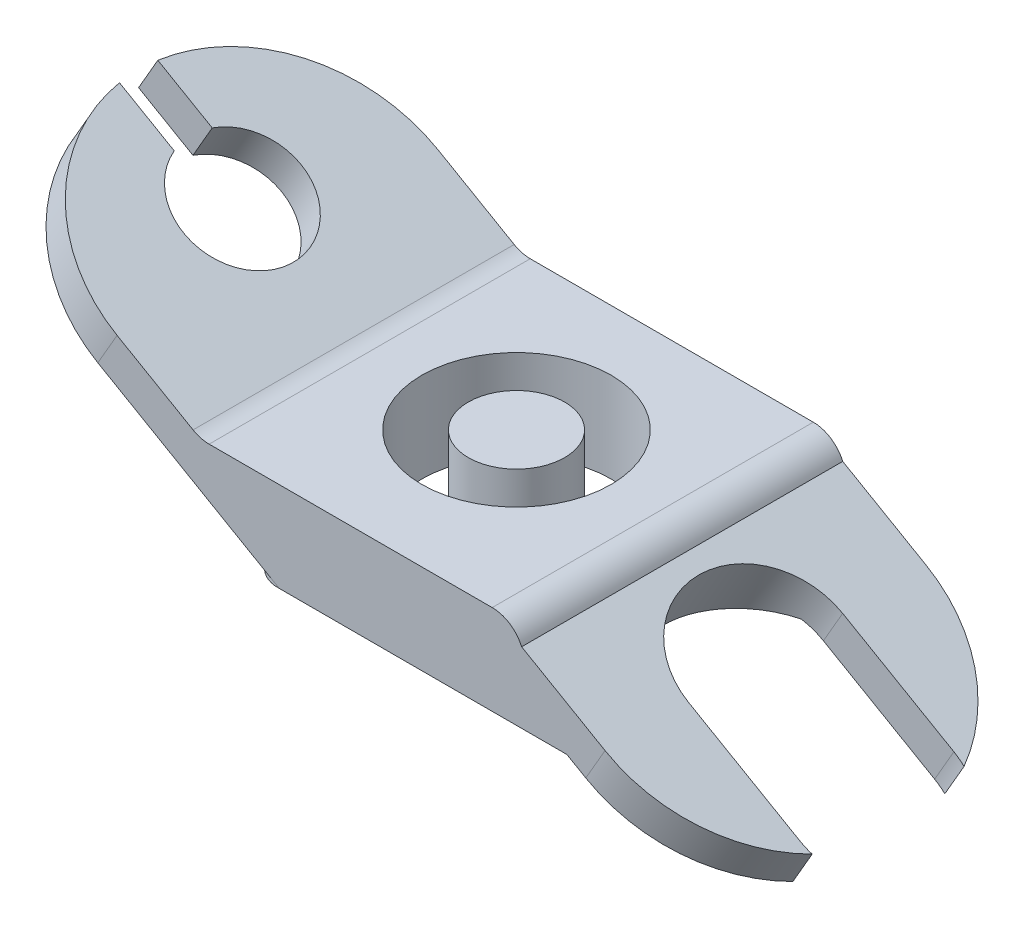
ISO-10303-21;
HEADER;
FILE_DESCRIPTION(('STEP AP214'),'2;1');
FILE_NAME('part.step','',(''),(''),'','','');
FILE_SCHEMA(('AUTOMOTIVE_DESIGN { 1 0 10303 214 1 1 1 1 }'));
ENDSEC;
DATA;
#1=APPLICATION_CONTEXT('core data for automotive mechanical design processes');
#2=APPLICATION_PROTOCOL_DEFINITION('international standard','automotive_design',2000,#1);
#3=PRODUCT_CONTEXT('',#1,'mechanical');
#4=PRODUCT('Part','Part','',(#3));
#5=PRODUCT_RELATED_PRODUCT_CATEGORY('part','',(#4));
#6=PRODUCT_DEFINITION_FORMATION('','',#4);
#7=PRODUCT_DEFINITION_CONTEXT('part definition',#1,'design');
#8=PRODUCT_DEFINITION('design','',#6,#7);
#9=PRODUCT_DEFINITION_SHAPE('','',#8);
#10=(LENGTH_UNIT() NAMED_UNIT(*) SI_UNIT(.MILLI.,.METRE.));
#11=(NAMED_UNIT(*) PLANE_ANGLE_UNIT() SI_UNIT($,.RADIAN.));
#12=(NAMED_UNIT(*) SI_UNIT($,.STERADIAN.) SOLID_ANGLE_UNIT());
#13=UNCERTAINTY_MEASURE_WITH_UNIT(LENGTH_MEASURE(1.E-05),#10,'distance_accuracy_value','');
#14=(GEOMETRIC_REPRESENTATION_CONTEXT(3) GLOBAL_UNCERTAINTY_ASSIGNED_CONTEXT((#13)) GLOBAL_UNIT_ASSIGNED_CONTEXT((#10,
#11,#12)) REPRESENTATION_CONTEXT('',''));
#15=CARTESIAN_POINT('',(0.,0.,0.));
#16=DIRECTION('',(0.,0.,1.));
#17=DIRECTION('',(1.,0.,0.));
#18=AXIS2_PLACEMENT_3D('',#15,#16,#17);
#19=CARTESIAN_POINT('',(74.5884572681199,-14.1961524227064,50.));
#20=DIRECTION('',(0.499999999999994,0.866025403784442,0.));
#21=DIRECTION('',(-0.866025403784442,0.499999999999994,0.));
#22=AXIS2_PLACEMENT_3D('',#19,#20,#21);
#23=PLANE('',#22);
#24=DIRECTION('',(-0.866025403784442,0.499999999999994,0.));
#25=VECTOR('',#24,1.);
#26=CARTESIAN_POINT('',(74.5884572681199,-14.1961524227064,13.));
#27=LINE('',#26,#25);
#28=CARTESIAN_POINT('',(70.2583302491977,-11.6961524227064,13.));
#29=VERTEX_POINT('',#28);
#30=CARTESIAN_POINT('',(52.9378221735089,-1.69615242270657,13.));
#31=VERTEX_POINT('',#30);
#32=EDGE_CURVE('E476',#29,#31,#27,.T.);
#33=ORIENTED_EDGE('',*,*,#32,.T.);
#34=CARTESIAN_POINT('',(52.9378221735089,-1.69615242270657,25.));
#35=DIRECTION('',(0.499999999999994,0.866025403784442,0.));
#36=DIRECTION('',(-0.866025403784442,0.499999999999994,0.));
#37=AXIS2_PLACEMENT_3D('',#34,#35,#36);
#38=CIRCLE('',#37,12.);
#39=CARTESIAN_POINT('',(50.,0.,13.4894714354298));
#40=VERTEX_POINT('',#39);
#41=EDGE_CURVE('E326',#31,#40,#38,.T.);
#42=ORIENTED_EDGE('',*,*,#41,.T.);
#43=DIRECTION('',(0.,0.,-1.));
#44=VECTOR('',#43,1.);
#45=CARTESIAN_POINT('',(50.,0.,50.));
#46=LINE('',#45,#44);
#47=CARTESIAN_POINT('',(50.,0.,0.));
#48=VERTEX_POINT('',#47);
#49=EDGE_CURVE('E228',#40,#48,#46,.T.);
#50=ORIENTED_EDGE('',*,*,#49,.T.);
#51=DIRECTION('',(0.866025403784442,-0.499999999999994,0.));
#52=VECTOR('',#51,1.);
#53=CARTESIAN_POINT('',(74.5884572681199,-14.1961524227064,0.));
#54=LINE('',#53,#52);
#55=CARTESIAN_POINT('',(52.9378221735089,-1.69615242270657,0.));
#56=VERTEX_POINT('',#55);
#57=EDGE_CURVE('E225',#48,#56,#54,.T.);
#58=ORIENTED_EDGE('',*,*,#57,.T.);
#59=CARTESIAN_POINT('',(52.9378221735089,-1.69615242270657,25.));
#60=DIRECTION('',(0.499999999999994,0.866025403784442,0.));
#61=DIRECTION('',(-0.866025403784442,0.499999999999994,0.));
#62=AXIS2_PLACEMENT_3D('',#59,#60,#61);
#63=CIRCLE('',#62,25.);
#64=CARTESIAN_POINT('',(72.0120316918612,-12.7086524227064,13.1720933804836));
#65=VERTEX_POINT('',#64);
#66=EDGE_CURVE('E220',#56,#65,#63,.F.);
#67=ORIENTED_EDGE('',*,*,#66,.T.);
#68=CARTESIAN_POINT('',(70.2583302491977,-11.6961524227064,25.));
#69=DIRECTION('',(0.499999999999994,0.866025403784442,0.));
#70=DIRECTION('',(-0.866025403784442,0.499999999999994,0.));
#71=AXIS2_PLACEMENT_3D('',#68,#69,#70);
#72=CIRCLE('',#71,12.);
#73=EDGE_CURVE('E62',#65,#29,#72,.T.);
#74=ORIENTED_EDGE('',*,*,#73,.T.);
#75=EDGE_LOOP('',(#33,#42,#50,#58,#67,#74));
#76=FACE_BOUND('',#75,.T.);
#77=ADVANCED_FACE('F47',(#76),#23,.F.);
#78=CARTESIAN_POINT('',(-41.6935750346355,33.9999999999998,50.));
#79=DIRECTION('',(-0.499999999999994,-0.866025403784442,0.));
#80=DIRECTION('',(0.866025403784442,-0.499999999999994,0.));
#81=AXIS2_PLACEMENT_3D('',#78,#79,#80);
#82=PLANE('',#81);
#83=DIRECTION('',(-0.866025403784442,0.499999999999994,0.));
#84=VECTOR('',#83,1.);
#85=CARTESIAN_POINT('',(4.29903810567661,7.44615242270668,28.1458706267444));
#86=LINE('',#85,#84);
#87=CARTESIAN_POINT('',(-32.9978385349474,28.9795141911029,28.1458706267443));
#88=VERTEX_POINT('',#87);
#89=CARTESIAN_POINT('',(-41.5214786123793,33.9006400842836,28.1458706267443));
#90=VERTEX_POINT('',#89);
#91=EDGE_CURVE('E323',#88,#90,#86,.T.);
#92=ORIENTED_EDGE('',*,*,#91,.T.);
#93=CARTESIAN_POINT('',(-20.0429399400244,21.4999999999999,25.));
#94=DIRECTION('',(-0.499999999999994,-0.866025403784442,0.));
#95=DIRECTION('',(0.866025403784442,-0.499999999999994,0.));
#96=AXIS2_PLACEMENT_3D('',#93,#94,#95);
#97=CIRCLE('',#96,25.);
#98=CARTESIAN_POINT('',(-20.0429399400244,21.4999999999999,50.));
#99=VERTEX_POINT('',#98);
#100=EDGE_CURVE('E192',#90,#99,#97,.F.);
#101=ORIENTED_EDGE('',*,*,#100,.T.);
#102=DIRECTION('',(-0.866025403784442,0.499999999999994,0.));
#103=VECTOR('',#102,1.);
#104=CARTESIAN_POINT('',(-41.6935750346355,33.9999999999998,50.));
#105=LINE('',#104,#103);
#106=CARTESIAN_POINT('',(-8.2128129211022,14.6698729810778,50.));
#107=VERTEX_POINT('',#106);
#108=EDGE_CURVE('E219',#107,#99,#105,.T.);
#109=ORIENTED_EDGE('',*,*,#108,.F.);
#110=DIRECTION('',(0.,0.,-1.));
#111=VECTOR('',#110,1.);
#112=CARTESIAN_POINT('',(-8.21281292110219,14.6698729810778,0.));
#113=LINE('',#112,#111);
#114=CARTESIAN_POINT('',(-8.2128129211022,14.6698729810778,0.));
#115=VERTEX_POINT('',#114);
#116=EDGE_CURVE('E269',#107,#115,#113,.T.);
#117=ORIENTED_EDGE('',*,*,#116,.T.);
#118=DIRECTION('',(-0.866025403784442,0.499999999999994,0.));
#119=VECTOR('',#118,1.);
#120=CARTESIAN_POINT('',(-41.6935750346355,33.9999999999998,0.));
#121=LINE('',#120,#119);
#122=CARTESIAN_POINT('',(-20.0429399400244,21.4999999999999,0.));
#123=VERTEX_POINT('',#122);
#124=EDGE_CURVE('E265',#115,#123,#121,.T.);
#125=ORIENTED_EDGE('',*,*,#124,.T.);
#126=CARTESIAN_POINT('',(-20.0429399400244,21.4999999999999,25.));
#127=DIRECTION('',(-0.499999999999994,-0.866025403784442,0.));
#128=DIRECTION('',(0.866025403784442,-0.499999999999994,0.));
#129=AXIS2_PLACEMENT_3D('',#126,#127,#128);
#130=CIRCLE('',#129,25.);
#131=CARTESIAN_POINT('',(-41.5520184684167,33.9182722783878,22.1458706267443));
#132=VERTEX_POINT('',#131);
#133=EDGE_CURVE('E268',#123,#132,#130,.F.);
#134=ORIENTED_EDGE('',*,*,#133,.T.);
#135=DIRECTION('',(-0.866025403784442,0.499999999999994,0.));
#136=VECTOR('',#135,1.);
#137=CARTESIAN_POINT('',(4.29903810567661,7.44615242270668,22.1458706267443));
#138=LINE('',#137,#136);
#139=CARTESIAN_POINT('',(-33.0852649662696,29.029989864761,22.1458706267443));
#140=VERTEX_POINT('',#139);
#141=EDGE_CURVE('E316',#140,#132,#138,.T.);
#142=ORIENTED_EDGE('',*,*,#141,.F.);
#143=CARTESIAN_POINT('',(-25.533320996791,24.6698729810777,25.));
#144=DIRECTION('',(0.499999999999994,0.866025403784442,0.));
#145=DIRECTION('',(-0.866025403784442,0.499999999999994,0.));
#146=AXIS2_PLACEMENT_3D('',#143,#144,#145);
#147=CIRCLE('',#146,9.1754308583741);
#148=EDGE_CURVE('E184',#88,#140,#147,.T.);
#149=ORIENTED_EDGE('',*,*,#148,.F.);
#150=EDGE_LOOP('',(#92,#101,#109,#117,#125,#134,#142,#149));
#151=FACE_BOUND('',#150,.T.);
#152=ADVANCED_FACE('F365',(#151),#82,.F.);
#153=CARTESIAN_POINT('',(0.,3.,50.));
#154=DIRECTION('',(0.499999999999994,0.866025403784442,0.));
#155=DIRECTION('',(-0.866025403784442,0.499999999999994,0.));
#156=AXIS2_PLACEMENT_3D('',#153,#154,#155);
#157=PLANE('',#156);
#158=DIRECTION('',(-0.866025403784442,0.499999999999994,0.));
#159=VECTOR('',#158,1.);
#160=CARTESIAN_POINT('',(0.,3.,28.1458706267444));
#161=LINE('',#160,#159);
#162=CARTESIAN_POINT('',(-35.9978385349473,23.7833617683962,28.1458706267443));
#163=VERTEX_POINT('',#162);
#164=CARTESIAN_POINT('',(-44.5214786123793,28.704487661577,28.1458706267443));
#165=VERTEX_POINT('',#164);
#166=EDGE_CURVE('E174',#163,#165,#161,.T.);
#167=ORIENTED_EDGE('',*,*,#166,.F.);
#168=CARTESIAN_POINT('',(-28.533320996791,19.473720558371,25.));
#169=DIRECTION('',(0.499999999999994,0.866025403784442,0.));
#170=DIRECTION('',(-0.866025403784442,0.499999999999994,0.));
#171=AXIS2_PLACEMENT_3D('',#168,#169,#170);
#172=CIRCLE('',#171,9.1754308583741);
#173=CARTESIAN_POINT('',(-36.0852649662695,23.8338374420544,22.1458706267443));
#174=VERTEX_POINT('',#173);
#175=EDGE_CURVE('E311',#163,#174,#172,.T.);
#176=ORIENTED_EDGE('',*,*,#175,.T.);
#177=DIRECTION('',(-0.866025403784442,0.499999999999994,0.));
#178=VECTOR('',#177,1.);
#179=CARTESIAN_POINT('',(0.,3.,22.1458706267443));
#180=LINE('',#179,#178);
#181=CARTESIAN_POINT('',(-44.5520184684166,28.7221198556811,22.1458706267443));
#182=VERTEX_POINT('',#181);
#183=EDGE_CURVE('E71',#174,#182,#180,.T.);
#184=ORIENTED_EDGE('',*,*,#183,.T.);
#185=CARTESIAN_POINT('',(-23.0429399400244,16.3038475772933,25.));
#186=DIRECTION('',(0.499999999999994,0.866025403784442,0.));
#187=DIRECTION('',(-0.866025403784442,0.499999999999994,0.));
#188=AXIS2_PLACEMENT_3D('',#185,#186,#187);
#189=CIRCLE('',#188,25.);
#190=CARTESIAN_POINT('',(-23.0429399400244,16.3038475772933,0.));
#191=VERTEX_POINT('',#190);
#192=EDGE_CURVE('E208',#182,#191,#189,.F.);
#193=ORIENTED_EDGE('',*,*,#192,.T.);
#194=DIRECTION('',(0.866025403784442,-0.499999999999994,0.));
#195=VECTOR('',#194,1.);
#196=CARTESIAN_POINT('',(0.,3.,0.));
#197=LINE('',#196,#195);
#198=CARTESIAN_POINT('',(0.,3.,0.));
#199=VERTEX_POINT('',#198);
#200=EDGE_CURVE('E204',#191,#199,#197,.T.);
#201=ORIENTED_EDGE('',*,*,#200,.T.);
#202=DIRECTION('',(0.,0.,-1.));
#203=VECTOR('',#202,1.);
#204=CARTESIAN_POINT('',(0.,3.,50.));
#205=LINE('',#204,#203);
#206=CARTESIAN_POINT('',(0.,3.,45.));
#207=VERTEX_POINT('',#206);
#208=EDGE_CURVE('E258',#207,#199,#205,.T.);
#209=ORIENTED_EDGE('',*,*,#208,.F.);
#210=CARTESIAN_POINT('',(5.,0.113248654051917,45.));
#211=DIRECTION('',(0.499999999999994,0.866025403784442,0.));
#212=DIRECTION('',(0.866025403784442,-0.499999999999994,0.));
#213=AXIS2_PLACEMENT_3D('',#210,#211,#212);
#214=ELLIPSE('',#213,5.77350269189623,5.);
#215=CARTESIAN_POINT('',(5.,0.113248654051917,50.));
#216=VERTEX_POINT('',#215);
#217=EDGE_CURVE('E201',#207,#216,#214,.T.);
#218=ORIENTED_EDGE('',*,*,#217,.T.);
#219=DIRECTION('',(0.866025403784442,-0.499999999999994,0.));
#220=VECTOR('',#219,1.);
#221=CARTESIAN_POINT('',(0.,3.,50.));
#222=LINE('',#221,#220);
#223=CARTESIAN_POINT('',(-23.0429399400244,16.3038475772933,50.));
#224=VERTEX_POINT('',#223);
#225=EDGE_CURVE('E199',#224,#216,#222,.T.);
#226=ORIENTED_EDGE('',*,*,#225,.F.);
#227=CARTESIAN_POINT('',(-23.0429399400244,16.3038475772933,25.));
#228=DIRECTION('',(0.499999999999994,0.866025403784442,0.));
#229=DIRECTION('',(-0.866025403784442,0.499999999999994,0.));
#230=AXIS2_PLACEMENT_3D('',#227,#228,#229);
#231=CIRCLE('',#230,25.);
#232=EDGE_CURVE('E191',#224,#165,#231,.F.);
#233=ORIENTED_EDGE('',*,*,#232,.T.);
#234=EDGE_LOOP('',(#167,#176,#184,#193,#201,#209,#218,#226,#233));
#235=FACE_BOUND('',#234,.T.);
#236=ADVANCED_FACE('F197',(#235),#157,.F.);
#237=CARTESIAN_POINT('',(-24.3419780457011,14.0538475772932,25.));
#238=DIRECTION('',(-0.499999999999994,-0.866025403784442,0.));
#239=DIRECTION('',(0.866025403784442,-0.499999999999994,0.));
#240=AXIS2_PLACEMENT_3D('',#237,#238,#239);
#241=CYLINDRICAL_SURFACE('',#240,25.);
#242=ORIENTED_EDGE('',*,*,#100,.F.);
#243=DIRECTION('',(-0.499999999999994,-0.866025403784442,0.));
#244=VECTOR('',#243,1.);
#245=CARTESIAN_POINT('',(-45.8205167180559,26.4544876615769,28.1458706267443));
#246=LINE('',#245,#244);
#247=EDGE_CURVE('E177',#90,#165,#246,.T.);
#248=ORIENTED_EDGE('',*,*,#247,.T.);
#249=ORIENTED_EDGE('',*,*,#232,.F.);
#250=DIRECTION('',(-0.499999999999994,-0.866025403784442,0.));
#251=VECTOR('',#250,1.);
#252=CARTESIAN_POINT('',(-24.3419780457011,14.0538475772932,50.));
#253=LINE('',#252,#251);
#254=EDGE_CURVE('E215',#99,#224,#253,.T.);
#255=ORIENTED_EDGE('',*,*,#254,.F.);
#256=EDGE_LOOP('',(#242,#248,#249,#255));
#257=FACE_BOUND('',#256,.T.);
#258=ADVANCED_FACE('F189',(#257),#241,.T.);
#259=CARTESIAN_POINT('',(0.,0.,50.));
#260=DIRECTION('',(1.,0.,0.));
#261=DIRECTION('',(0.,0.,-1.));
#262=AXIS2_PLACEMENT_3D('',#259,#260,#261);
#263=PLANE('',#262);
#264=DIRECTION('',(0.,0.,-1.));
#265=VECTOR('',#264,1.);
#266=CARTESIAN_POINT('',(0.,0.,50.));
#267=LINE('',#266,#265);
#268=CARTESIAN_POINT('',(0.,0.,45.));
#269=VERTEX_POINT('',#268);
#270=CARTESIAN_POINT('',(0.,0.,0.));
#271=VERTEX_POINT('',#270);
#272=EDGE_CURVE('E246',#269,#271,#267,.T.);
#273=ORIENTED_EDGE('',*,*,#272,.F.);
#274=DIRECTION('',(0.,-1.,0.));
#275=VECTOR('',#274,1.);
#276=CARTESIAN_POINT('',(0.,0.,45.));
#277=LINE('',#276,#275);
#278=EDGE_CURVE('E194',#269,#207,#277,.F.);
#279=ORIENTED_EDGE('',*,*,#278,.T.);
#280=ORIENTED_EDGE('',*,*,#208,.T.);
#281=DIRECTION('',(0.,-1.,0.));
#282=VECTOR('',#281,1.);
#283=CARTESIAN_POINT('',(0.,0.,0.));
#284=LINE('',#283,#282);
#285=EDGE_CURVE('E261',#199,#271,#284,.T.);
#286=ORIENTED_EDGE('',*,*,#285,.T.);
#287=EDGE_LOOP('',(#273,#279,#280,#286));
#288=FACE_BOUND('',#287,.T.);
#289=ADVANCED_FACE('F516',(#288),#263,.F.);
#290=CARTESIAN_POINT('',(0.,0.,50.));
#291=DIRECTION('',(0.,1.,0.));
#292=DIRECTION('',(0.,0.,1.));
#293=AXIS2_PLACEMENT_3D('',#290,#291,#292);
#294=PLANE('',#293);
#295=CARTESIAN_POINT('',(16.2871870788978,0.,24.1412740190441));
#296=DIRECTION('',(0.,1.,0.));
#297=DIRECTION('',(0.,0.,1.));
#298=AXIS2_PLACEMENT_3D('',#295,#296,#297);
#299=CIRCLE('',#298,14.7395245327147);
#300=CARTESIAN_POINT('',(16.2871870788978,0.,38.8807985517588));
#301=VERTEX_POINT('',#300);
#302=EDGE_CURVE('E287',#301,#301,#299,.T.);
#303=ORIENTED_EDGE('',*,*,#302,.T.);
#304=EDGE_LOOP('',(#303));
#305=FACE_BOUND('',#304,.T.);
#306=ORIENTED_EDGE('',*,*,#49,.F.);
#307=CARTESIAN_POINT('',(53.9170962313451,0.,25.));
#308=DIRECTION('',(0.,1.,0.));
#309=DIRECTION('',(1.,0.,0.));
#310=AXIS2_PLACEMENT_3D('',#307,#308,#309);
#311=ELLIPSE('',#310,13.856406460551,12.);
#312=CARTESIAN_POINT('',(50.,0.,36.5105285645702));
#313=VERTEX_POINT('',#312);
#314=EDGE_CURVE('E483',#40,#313,#311,.T.);
#315=ORIENTED_EDGE('',*,*,#314,.T.);
#316=CARTESIAN_POINT('',(50.,0.,50.));
#317=VERTEX_POINT('',#316);
#318=EDGE_CURVE('E245',#317,#313,#46,.T.);
#319=ORIENTED_EDGE('',*,*,#318,.F.);
#320=DIRECTION('',(1.,0.,0.));
#321=VECTOR('',#320,1.);
#322=CARTESIAN_POINT('',(0.,0.,50.));
#323=LINE('',#322,#321);
#324=CARTESIAN_POINT('',(5.,0.,50.));
#325=VERTEX_POINT('',#324);
#326=EDGE_CURVE('E306',#325,#317,#323,.T.);
#327=ORIENTED_EDGE('',*,*,#326,.F.);
#328=CARTESIAN_POINT('',(5.,0.,45.));
#329=DIRECTION('',(0.,1.,0.));
#330=DIRECTION('',(0.,0.,1.));
#331=AXIS2_PLACEMENT_3D('',#328,#329,#330);
#332=CIRCLE('',#331,5.);
#333=EDGE_CURVE('E250',#325,#269,#332,.F.);
#334=ORIENTED_EDGE('',*,*,#333,.T.);
#335=ORIENTED_EDGE('',*,*,#272,.T.);
#336=DIRECTION('',(1.,0.,0.));
#337=VECTOR('',#336,1.);
#338=CARTESIAN_POINT('',(0.,0.,0.));
#339=LINE('',#338,#337);
#340=EDGE_CURVE('E249',#271,#48,#339,.T.);
#341=ORIENTED_EDGE('',*,*,#340,.T.);
#342=EDGE_LOOP('',(#306,#315,#319,#327,#334,#335,#341));
#343=FACE_BOUND('',#342,.T.);
#344=ADVANCED_FACE('F49',(#305,#343),#294,.F.);
#345=ORIENTED_EDGE('',*,*,#318,.T.);
#346=CARTESIAN_POINT('',(52.9378221735089,-1.69615242270658,37.));
#347=VERTEX_POINT('',#346);
#348=EDGE_CURVE('E480',#313,#347,#38,.T.);
#349=ORIENTED_EDGE('',*,*,#348,.T.);
#350=DIRECTION('',(0.866025403784442,-0.499999999999994,0.));
#351=VECTOR('',#350,1.);
#352=CARTESIAN_POINT('',(74.5884572681199,-14.1961524227064,37.));
#353=LINE('',#352,#351);
#354=CARTESIAN_POINT('',(70.2583302491977,-11.6961524227064,37.));
#355=VERTEX_POINT('',#354);
#356=EDGE_CURVE('E432',#347,#355,#353,.T.);
#357=ORIENTED_EDGE('',*,*,#356,.T.);
#358=CARTESIAN_POINT('',(72.0120316918612,-12.7086524227064,36.8279066195164));
#359=VERTEX_POINT('',#358);
#360=EDGE_CURVE('E471',#355,#359,#72,.T.);
#361=ORIENTED_EDGE('',*,*,#360,.T.);
#362=CARTESIAN_POINT('',(52.9378221735089,-1.69615242270657,25.));
#363=DIRECTION('',(0.499999999999994,0.866025403784442,0.));
#364=DIRECTION('',(-0.866025403784442,0.499999999999994,0.));
#365=AXIS2_PLACEMENT_3D('',#362,#363,#364);
#366=CIRCLE('',#365,25.);
#367=CARTESIAN_POINT('',(52.9378221735089,-1.69615242270657,50.));
#368=VERTEX_POINT('',#367);
#369=EDGE_CURVE('E224',#359,#368,#366,.F.);
#370=ORIENTED_EDGE('',*,*,#369,.T.);
#371=DIRECTION('',(0.866025403784442,-0.499999999999994,0.));
#372=VECTOR('',#371,1.);
#373=CARTESIAN_POINT('',(74.5884572681199,-14.1961524227064,50.));
#374=LINE('',#373,#372);
#375=EDGE_CURVE('E214',#317,#368,#374,.T.);
#376=ORIENTED_EDGE('',*,*,#375,.F.);
#377=EDGE_LOOP('',(#345,#349,#357,#361,#370,#376));
#378=FACE_BOUND('',#377,.T.);
#379=ADVANCED_FACE('F502',(#378),#23,.F.);
#380=CARTESIAN_POINT('',(42.9474411167422,11.,50.));
#381=DIRECTION('',(-0.499999999999994,-0.866025403784442,0.));
#382=DIRECTION('',(0.866025403784442,-0.499999999999994,0.));
#383=AXIS2_PLACEMENT_3D('',#380,#381,#382);
#384=PLANE('',#383);
#385=DIRECTION('',(-0.866025403784442,0.499999999999994,0.));
#386=VECTOR('',#385,1.);
#387=CARTESIAN_POINT('',(55.9378221735089,3.50000000000008,13.));
#388=LINE('',#387,#386);
#389=CARTESIAN_POINT('',(73.2583302491976,-6.49999999999976,13.));
#390=VERTEX_POINT('',#389);
#391=CARTESIAN_POINT('',(55.9378221735089,3.50000000000008,13.));
#392=VERTEX_POINT('',#391);
#393=EDGE_CURVE('E437',#390,#392,#388,.T.);
#394=ORIENTED_EDGE('',*,*,#393,.F.);
#395=CARTESIAN_POINT('',(73.2583302491976,-6.49999999999976,25.));
#396=DIRECTION('',(0.499999999999994,0.866025403784442,0.));
#397=DIRECTION('',(-0.866025403784442,0.499999999999994,0.));
#398=AXIS2_PLACEMENT_3D('',#395,#396,#397);
#399=CIRCLE('',#398,12.);
#400=CARTESIAN_POINT('',(75.0120316918612,-7.51249999999978,13.1720933804836));
#401=VERTEX_POINT('',#400);
#402=EDGE_CURVE('E452',#401,#390,#399,.T.);
#403=ORIENTED_EDGE('',*,*,#402,.F.);
#404=CARTESIAN_POINT('',(55.9378221735088,3.50000000000008,25.));
#405=DIRECTION('',(-0.499999999999994,-0.866025403784442,0.));
#406=DIRECTION('',(0.866025403784442,-0.499999999999994,0.));
#407=AXIS2_PLACEMENT_3D('',#404,#405,#406);
#408=CIRCLE('',#407,25.);
#409=CARTESIAN_POINT('',(55.9378221735088,3.50000000000008,0.));
#410=VERTEX_POINT('',#409);
#411=EDGE_CURVE('E237',#401,#410,#408,.F.);
#412=ORIENTED_EDGE('',*,*,#411,.T.);
#413=DIRECTION('',(-0.866025403784442,0.499999999999994,0.));
#414=VECTOR('',#413,1.);
#415=CARTESIAN_POINT('',(42.9474411167422,11.,0.));
#416=LINE('',#415,#414);
#417=CARTESIAN_POINT('',(42.9474411167422,11.,0.));
#418=VERTEX_POINT('',#417);
#419=EDGE_CURVE('E240',#410,#418,#416,.T.);
#420=ORIENTED_EDGE('',*,*,#419,.T.);
#421=DIRECTION('',(0.,0.,-1.));
#422=VECTOR('',#421,1.);
#423=CARTESIAN_POINT('',(42.9474411167422,11.,50.));
#424=LINE('',#423,#422);
#425=CARTESIAN_POINT('',(42.9474411167422,11.,50.));
#426=VERTEX_POINT('',#425);
#427=EDGE_CURVE('E254',#426,#418,#424,.T.);
#428=ORIENTED_EDGE('',*,*,#427,.F.);
#429=DIRECTION('',(-0.866025403784442,0.499999999999994,0.));
#430=VECTOR('',#429,1.);
#431=CARTESIAN_POINT('',(42.9474411167422,11.,50.));
#432=LINE('',#431,#430);
#433=CARTESIAN_POINT('',(55.9378221735088,3.50000000000008,50.));
#434=VERTEX_POINT('',#433);
#435=EDGE_CURVE('E213',#434,#426,#432,.T.);
#436=ORIENTED_EDGE('',*,*,#435,.F.);
#437=CARTESIAN_POINT('',(55.9378221735088,3.50000000000008,25.));
#438=DIRECTION('',(-0.499999999999994,-0.866025403784442,0.));
#439=DIRECTION('',(0.866025403784442,-0.499999999999994,0.));
#440=AXIS2_PLACEMENT_3D('',#437,#438,#439);
#441=CIRCLE('',#440,25.);
#442=CARTESIAN_POINT('',(75.0120316918612,-7.51249999999978,36.8279066195164));
#443=VERTEX_POINT('',#442);
#444=EDGE_CURVE('E241',#434,#443,#441,.F.);
#445=ORIENTED_EDGE('',*,*,#444,.T.);
#446=CARTESIAN_POINT('',(73.2583302491976,-6.49999999999976,37.));
#447=VERTEX_POINT('',#446);
#448=EDGE_CURVE('E450',#447,#443,#399,.T.);
#449=ORIENTED_EDGE('',*,*,#448,.F.);
#450=DIRECTION('',(0.866025403784442,-0.499999999999994,0.));
#451=VECTOR('',#450,1.);
#452=CARTESIAN_POINT('',(55.9378221735089,3.50000000000008,37.));
#453=LINE('',#452,#451);
#454=CARTESIAN_POINT('',(55.9378221735089,3.50000000000008,37.));
#455=VERTEX_POINT('',#454);
#456=EDGE_CURVE('E429',#455,#447,#453,.T.);
#457=ORIENTED_EDGE('',*,*,#456,.F.);
#458=CARTESIAN_POINT('',(55.9378221735089,3.50000000000008,25.));
#459=DIRECTION('',(0.499999999999994,0.866025403784442,0.));
#460=DIRECTION('',(-0.866025403784442,0.499999999999994,0.));
#461=AXIS2_PLACEMENT_3D('',#458,#459,#460);
#462=CIRCLE('',#461,12.);
#463=EDGE_CURVE('E440',#392,#455,#462,.T.);
#464=ORIENTED_EDGE('',*,*,#463,.F.);
#465=EDGE_LOOP('',(#394,#403,#412,#420,#428,#436,#445,#449,#457,#464));
#466=FACE_BOUND('',#465,.T.);
#467=ADVANCED_FACE('F449',(#466),#384,.F.);
#468=CARTESIAN_POINT('',(-7.05255888325781,14.,50.));
#469=DIRECTION('',(0.,-1.,0.));
#470=DIRECTION('',(1.,0.,0.));
#471=AXIS2_PLACEMENT_3D('',#468,#469,#470);
#472=PLANE('',#471);
#473=CARTESIAN_POINT('',(16.2871870788978,14.,24.1412740190441));
#474=DIRECTION('',(0.,1.,0.));
#475=DIRECTION('',(-1.,0.,0.));
#476=AXIS2_PLACEMENT_3D('',#473,#474,#475);
#477=CIRCLE('',#476,14.7395245327147);
#478=CARTESIAN_POINT('',(1.54766254618304,14.,24.1412740190441));
#479=VERTEX_POINT('',#478);
#480=EDGE_CURVE('E56',#479,#479,#477,.T.);
#481=ORIENTED_EDGE('',*,*,#480,.F.);
#482=EDGE_LOOP('',(#481));
#483=FACE_BOUND('',#482,.T.);
#484=DIRECTION('',(-1.,0.,0.));
#485=VECTOR('',#484,1.);
#486=CARTESIAN_POINT('',(-7.05255888325781,14.,0.));
#487=LINE('',#486,#485);
#488=CARTESIAN_POINT('',(38.3648654217863,14.,0.));
#489=VERTEX_POINT('',#488);
#490=CARTESIAN_POINT('',(-5.71281292110222,14.,0.));
#491=VERTEX_POINT('',#490);
#492=EDGE_CURVE('E270',#489,#491,#487,.T.);
#493=ORIENTED_EDGE('',*,*,#492,.T.);
#494=DIRECTION('',(0.,0.,-1.));
#495=VECTOR('',#494,1.);
#496=CARTESIAN_POINT('',(-5.71281292110222,14.,50.));
#497=LINE('',#496,#495);
#498=CARTESIAN_POINT('',(-5.71281292110222,14.,50.));
#499=VERTEX_POINT('',#498);
#500=EDGE_CURVE('E274',#491,#499,#497,.F.);
#501=ORIENTED_EDGE('',*,*,#500,.T.);
#502=DIRECTION('',(-1.,0.,0.));
#503=VECTOR('',#502,1.);
#504=CARTESIAN_POINT('',(-7.05255888325781,14.,50.));
#505=LINE('',#504,#503);
#506=CARTESIAN_POINT('',(38.3648654217863,14.,50.));
#507=VERTEX_POINT('',#506);
#508=EDGE_CURVE('E296',#507,#499,#505,.T.);
#509=ORIENTED_EDGE('',*,*,#508,.F.);
#510=DIRECTION('',(0.,0.,1.));
#511=VECTOR('',#510,1.);
#512=CARTESIAN_POINT('',(38.3648654217863,14.,50.));
#513=LINE('',#512,#511);
#514=EDGE_CURVE('E291',#507,#489,#513,.F.);
#515=ORIENTED_EDGE('',*,*,#514,.T.);
#516=EDGE_LOOP('',(#493,#501,#509,#515));
#517=FACE_BOUND('',#516,.T.);
#518=ADVANCED_FACE('F515',(#483,#517),#472,.F.);
#519=CARTESIAN_POINT('',(0.,0.,50.));
#520=DIRECTION('',(0.,0.,-1.));
#521=DIRECTION('',(-1.,0.,0.));
#522=AXIS2_PLACEMENT_3D('',#519,#520,#521);
#523=PLANE('',#522);
#524=ORIENTED_EDGE('',*,*,#225,.T.);
#525=DIRECTION('',(0.,-1.,0.));
#526=VECTOR('',#525,1.);
#527=CARTESIAN_POINT('',(5.,0.,50.));
#528=LINE('',#527,#526);
#529=EDGE_CURVE('E290',#216,#325,#528,.T.);
#530=ORIENTED_EDGE('',*,*,#529,.T.);
#531=ORIENTED_EDGE('',*,*,#326,.T.);
#532=ORIENTED_EDGE('',*,*,#375,.T.);
#533=DIRECTION('',(0.499999999999994,0.866025403784442,0.));
#534=VECTOR('',#533,1.);
#535=CARTESIAN_POINT('',(40.4378221735092,-23.3467875173174,50.));
#536=LINE('',#535,#534);
#537=EDGE_CURVE('E210',#368,#434,#536,.T.);
#538=ORIENTED_EDGE('',*,*,#537,.T.);
#539=ORIENTED_EDGE('',*,*,#435,.T.);
#540=CARTESIAN_POINT('',(38.3648654217863,9.,50.));
#541=DIRECTION('',(0.,0.,-1.));
#542=DIRECTION('',(-1.,0.,0.));
#543=AXIS2_PLACEMENT_3D('',#540,#541,#542);
#544=CIRCLE('',#543,5.);
#545=EDGE_CURVE('E300',#426,#507,#544,.F.);
#546=ORIENTED_EDGE('',*,*,#545,.T.);
#547=ORIENTED_EDGE('',*,*,#508,.T.);
#548=CARTESIAN_POINT('',(-5.71281292110222,19.,50.));
#549=DIRECTION('',(0.,0.,-1.));
#550=DIRECTION('',(-1.,0.,0.));
#551=AXIS2_PLACEMENT_3D('',#548,#549,#550);
#552=CIRCLE('',#551,5.);
#553=EDGE_CURVE('E295',#499,#107,#552,.T.);
#554=ORIENTED_EDGE('',*,*,#553,.T.);
#555=ORIENTED_EDGE('',*,*,#108,.T.);
#556=ORIENTED_EDGE('',*,*,#254,.T.);
#557=EDGE_LOOP('',(#524,#530,#531,#532,#538,#539,#546,#547,#554,#555,#556));
#558=FACE_BOUND('',#557,.T.);
#559=ADVANCED_FACE('F368',(#558),#523,.F.);
#560=CARTESIAN_POINT('',(0.,0.,0.));
#561=DIRECTION('',(0.,0.,-1.));
#562=DIRECTION('',(-1.,0.,0.));
#563=AXIS2_PLACEMENT_3D('',#560,#561,#562);
#564=PLANE('',#563);
#565=ORIENTED_EDGE('',*,*,#492,.F.);
#566=CARTESIAN_POINT('',(38.3648654217863,9.,0.));
#567=DIRECTION('',(0.,0.,-1.));
#568=DIRECTION('',(-1.,0.,0.));
#569=AXIS2_PLACEMENT_3D('',#566,#567,#568);
#570=CIRCLE('',#569,5.);
#571=EDGE_CURVE('E218',#489,#418,#570,.T.);
#572=ORIENTED_EDGE('',*,*,#571,.T.);
#573=ORIENTED_EDGE('',*,*,#419,.F.);
#574=DIRECTION('',(0.499999999999994,0.866025403784442,0.));
#575=VECTOR('',#574,1.);
#576=CARTESIAN_POINT('',(52.9378221735089,-1.69615242270658,0.));
#577=LINE('',#576,#575);
#578=EDGE_CURVE('E229',#410,#56,#577,.F.);
#579=ORIENTED_EDGE('',*,*,#578,.T.);
#580=ORIENTED_EDGE('',*,*,#57,.F.);
#581=ORIENTED_EDGE('',*,*,#340,.F.);
#582=ORIENTED_EDGE('',*,*,#285,.F.);
#583=ORIENTED_EDGE('',*,*,#200,.F.);
#584=DIRECTION('',(-0.499999999999994,-0.866025403784442,0.));
#585=VECTOR('',#584,1.);
#586=CARTESIAN_POINT('',(-20.0429399400244,21.4999999999999,0.));
#587=LINE('',#586,#585);
#588=EDGE_CURVE('E233',#191,#123,#587,.F.);
#589=ORIENTED_EDGE('',*,*,#588,.T.);
#590=ORIENTED_EDGE('',*,*,#124,.F.);
#591=CARTESIAN_POINT('',(-5.71281292110222,19.,0.));
#592=DIRECTION('',(0.,0.,-1.));
#593=DIRECTION('',(-1.,0.,0.));
#594=AXIS2_PLACEMENT_3D('',#591,#592,#593);
#595=CIRCLE('',#594,5.);
#596=EDGE_CURVE('E100',#115,#491,#595,.F.);
#597=ORIENTED_EDGE('',*,*,#596,.T.);
#598=EDGE_LOOP('',(#565,#572,#573,#579,#580,#581,#582,#583,#589,#590,#597));
#599=FACE_BOUND('',#598,.T.);
#600=ADVANCED_FACE('F376',(#599),#564,.T.);
#601=CARTESIAN_POINT('',(40.4378221735092,-23.3467875173174,25.));
#602=DIRECTION('',(0.499999999999994,0.866025403784442,0.));
#603=DIRECTION('',(-0.866025403784442,0.499999999999994,0.));
#604=AXIS2_PLACEMENT_3D('',#601,#602,#603);
#605=CYLINDRICAL_SURFACE('',#604,25.);
#606=DIRECTION('',(0.499999999999994,0.866025403784442,0.));
#607=VECTOR('',#606,1.);
#608=CARTESIAN_POINT('',(62.5120316918614,-29.1631350946108,36.8279066195164));
#609=LINE('',#608,#607);
#610=EDGE_CURVE('E470',#443,#359,#609,.F.);
#611=ORIENTED_EDGE('',*,*,#610,.F.);
#612=ORIENTED_EDGE('',*,*,#444,.F.);
#613=ORIENTED_EDGE('',*,*,#537,.F.);
#614=ORIENTED_EDGE('',*,*,#369,.F.);
#615=EDGE_LOOP('',(#611,#612,#613,#614));
#616=FACE_BOUND('',#615,.T.);
#617=ADVANCED_FACE('F532',(#616),#605,.T.);
#618=CARTESIAN_POINT('',(55.9378221735088,3.50000000000008,25.));
#619=DIRECTION('',(-0.499999999999994,-0.866025403784442,0.));
#620=DIRECTION('',(0.866025403784442,-0.499999999999994,0.));
#621=AXIS2_PLACEMENT_3D('',#618,#619,#620);
#622=CYLINDRICAL_SURFACE('',#621,25.);
#623=DIRECTION('',(0.499999999999994,0.866025403784442,0.));
#624=VECTOR('',#623,1.);
#625=CARTESIAN_POINT('',(62.5120316918614,-29.1631350946108,13.1720933804836));
#626=LINE('',#625,#624);
#627=EDGE_CURVE('E12',#65,#401,#626,.T.);
#628=ORIENTED_EDGE('',*,*,#627,.F.);
#629=ORIENTED_EDGE('',*,*,#66,.F.);
#630=ORIENTED_EDGE('',*,*,#578,.F.);
#631=ORIENTED_EDGE('',*,*,#411,.F.);
#632=EDGE_LOOP('',(#628,#629,#630,#631));
#633=FACE_BOUND('',#632,.T.);
#634=ADVANCED_FACE('F546',(#633),#622,.T.);
#635=CARTESIAN_POINT('',(-23.0429399400244,16.3038475772933,25.));
#636=DIRECTION('',(0.499999999999994,0.866025403784442,0.));
#637=DIRECTION('',(-0.866025403784442,0.499999999999994,0.));
#638=AXIS2_PLACEMENT_3D('',#635,#636,#637);
#639=CYLINDRICAL_SURFACE('',#638,25.);
#640=DIRECTION('',(0.499999999999994,0.866025403784442,0.));
#641=VECTOR('',#640,1.);
#642=CARTESIAN_POINT('',(-44.5520184684166,28.7221198556811,22.1458706267443));
#643=LINE('',#642,#641);
#644=EDGE_CURVE('E320',#132,#182,#643,.F.);
#645=ORIENTED_EDGE('',*,*,#644,.F.);
#646=ORIENTED_EDGE('',*,*,#133,.F.);
#647=ORIENTED_EDGE('',*,*,#588,.F.);
#648=ORIENTED_EDGE('',*,*,#192,.F.);
#649=EDGE_LOOP('',(#645,#646,#647,#648));
#650=FACE_BOUND('',#649,.T.);
#651=ADVANCED_FACE('F382',(#650),#639,.T.);
#652=CARTESIAN_POINT('',(38.3648654217863,9.,50.));
#653=DIRECTION('',(0.,0.,1.));
#654=DIRECTION('',(1.,0.,0.));
#655=AXIS2_PLACEMENT_3D('',#652,#653,#654);
#656=CYLINDRICAL_SURFACE('',#655,5.);
#657=ORIENTED_EDGE('',*,*,#545,.F.);
#658=ORIENTED_EDGE('',*,*,#427,.T.);
#659=ORIENTED_EDGE('',*,*,#571,.F.);
#660=ORIENTED_EDGE('',*,*,#514,.F.);
#661=EDGE_LOOP('',(#657,#658,#659,#660));
#662=FACE_BOUND('',#661,.T.);
#663=ADVANCED_FACE('F540',(#662),#656,.T.);
#664=CARTESIAN_POINT('',(5.,0.,45.));
#665=DIRECTION('',(0.,-1.,0.));
#666=DIRECTION('',(0.,0.,-1.));
#667=AXIS2_PLACEMENT_3D('',#664,#665,#666);
#668=CYLINDRICAL_SURFACE('',#667,5.);
#669=ORIENTED_EDGE('',*,*,#217,.F.);
#670=ORIENTED_EDGE('',*,*,#278,.F.);
#671=ORIENTED_EDGE('',*,*,#333,.F.);
#672=ORIENTED_EDGE('',*,*,#529,.F.);
#673=EDGE_LOOP('',(#669,#670,#671,#672));
#674=FACE_BOUND('',#673,.T.);
#675=ADVANCED_FACE('F556',(#674),#668,.T.);
#676=CARTESIAN_POINT('',(-5.71281292110222,19.,50.));
#677=DIRECTION('',(0.,0.,1.));
#678=DIRECTION('',(1.,0.,0.));
#679=AXIS2_PLACEMENT_3D('',#676,#677,#678);
#680=CYLINDRICAL_SURFACE('',#679,5.);
#681=ORIENTED_EDGE('',*,*,#553,.F.);
#682=ORIENTED_EDGE('',*,*,#500,.F.);
#683=ORIENTED_EDGE('',*,*,#596,.F.);
#684=ORIENTED_EDGE('',*,*,#116,.F.);
#685=EDGE_LOOP('',(#681,#682,#683,#684));
#686=FACE_BOUND('',#685,.T.);
#687=ADVANCED_FACE('F371',(#686),#680,.F.);
#688=CARTESIAN_POINT('',(-50.5333209967907,-18.6313972081444,25.));
#689=DIRECTION('',(0.499999999999994,0.866025403784442,0.));
#690=DIRECTION('',(-0.866025403784442,0.499999999999994,0.));
#691=AXIS2_PLACEMENT_3D('',#688,#689,#690);
#692=CYLINDRICAL_SURFACE('',#691,9.1754308583741);
#693=DIRECTION('',(0.499999999999994,0.866025403784442,0.));
#694=VECTOR('',#693,1.);
#695=CARTESIAN_POINT('',(-57.9978385349471,-14.3217559981193,28.1458706267443));
#696=LINE('',#695,#694);
#697=EDGE_CURVE('E90',#163,#88,#696,.T.);
#698=ORIENTED_EDGE('',*,*,#697,.T.);
#699=ORIENTED_EDGE('',*,*,#148,.T.);
#700=DIRECTION('',(0.499999999999994,0.866025403784442,0.));
#701=VECTOR('',#700,1.);
#702=CARTESIAN_POINT('',(-58.0852649662692,-14.2712803244611,22.1458706267443));
#703=LINE('',#702,#701);
#704=EDGE_CURVE('E183',#174,#140,#703,.T.);
#705=ORIENTED_EDGE('',*,*,#704,.F.);
#706=ORIENTED_EDGE('',*,*,#175,.F.);
#707=EDGE_LOOP('',(#698,#699,#705,#706));
#708=FACE_BOUND('',#707,.T.);
#709=ADVANCED_FACE('F487',(#708),#692,.F.);
#710=CARTESIAN_POINT('',(-20.7009618943231,-35.8551177665154,28.1458706267444));
#711=DIRECTION('',(0.,0.,-1.));
#712=DIRECTION('',(-1.,0.,0.));
#713=AXIS2_PLACEMENT_3D('',#710,#711,#712);
#714=PLANE('',#713);
#715=ORIENTED_EDGE('',*,*,#166,.T.);
#716=ORIENTED_EDGE('',*,*,#247,.F.);
#717=ORIENTED_EDGE('',*,*,#91,.F.);
#718=ORIENTED_EDGE('',*,*,#697,.F.);
#719=EDGE_LOOP('',(#715,#716,#717,#718));
#720=FACE_BOUND('',#719,.T.);
#721=ADVANCED_FACE('F176',(#720),#714,.T.);
#722=CARTESIAN_POINT('',(-20.7009618943231,-35.8551177665154,22.1458706267443));
#723=DIRECTION('',(0.,0.,-1.));
#724=DIRECTION('',(-1.,0.,0.));
#725=AXIS2_PLACEMENT_3D('',#722,#723,#724);
#726=PLANE('',#725);
#727=ORIENTED_EDGE('',*,*,#704,.T.);
#728=ORIENTED_EDGE('',*,*,#141,.T.);
#729=ORIENTED_EDGE('',*,*,#644,.T.);
#730=ORIENTED_EDGE('',*,*,#183,.F.);
#731=EDGE_LOOP('',(#727,#728,#729,#730));
#732=FACE_BOUND('',#731,.T.);
#733=ADVANCED_FACE('F488',(#732),#726,.F.);
#734=CARTESIAN_POINT('',(16.2871870788978,-36.,24.1412740190441));
#735=DIRECTION('',(0.,1.,0.));
#736=DIRECTION('',(-1.,0.,0.));
#737=AXIS2_PLACEMENT_3D('',#734,#735,#736);
#738=CYLINDRICAL_SURFACE('',#737,14.7395245327147);
#739=ORIENTED_EDGE('',*,*,#480,.T.);
#740=EDGE_LOOP('',(#739));
#741=FACE_BOUND('',#740,.T.);
#742=ORIENTED_EDGE('',*,*,#302,.F.);
#743=EDGE_LOOP('',(#742));
#744=FACE_BOUND('',#743,.T.);
#745=ADVANCED_FACE('F490',(#741,#744),#738,.F.);
#746=CARTESIAN_POINT('',(30.9378221735092,-39.801270189222,25.));
#747=DIRECTION('',(0.499999999999994,0.866025403784442,0.));
#748=DIRECTION('',(-0.866025403784442,0.499999999999994,0.));
#749=AXIS2_PLACEMENT_3D('',#746,#747,#748);
#750=CYLINDRICAL_SURFACE('',#749,12.);
#751=DIRECTION('',(0.499999999999994,0.866025403784442,0.));
#752=VECTOR('',#751,1.);
#753=CARTESIAN_POINT('',(30.9378221735092,-39.801270189222,13.));
#754=LINE('',#753,#752);
#755=EDGE_CURVE('E443',#31,#392,#754,.T.);
#756=ORIENTED_EDGE('',*,*,#755,.T.);
#757=ORIENTED_EDGE('',*,*,#463,.T.);
#758=DIRECTION('',(0.499999999999994,0.866025403784442,0.));
#759=VECTOR('',#758,1.);
#760=CARTESIAN_POINT('',(30.9378221735092,-39.801270189222,37.));
#761=LINE('',#760,#759);
#762=EDGE_CURVE('E424',#347,#455,#761,.T.);
#763=ORIENTED_EDGE('',*,*,#762,.F.);
#764=ORIENTED_EDGE('',*,*,#348,.F.);
#765=ORIENTED_EDGE('',*,*,#314,.F.);
#766=ORIENTED_EDGE('',*,*,#41,.F.);
#767=EDGE_LOOP('',(#756,#757,#763,#764,#765,#766));
#768=FACE_BOUND('',#767,.T.);
#769=ADVANCED_FACE('F441',(#768),#750,.F.);
#770=CARTESIAN_POINT('',(30.9378221735092,-39.801270189222,13.));
#771=DIRECTION('',(0.,0.,-1.));
#772=DIRECTION('',(-1.,0.,0.));
#773=AXIS2_PLACEMENT_3D('',#770,#771,#772);
#774=PLANE('',#773);
#775=DIRECTION('',(0.499999999999994,0.866025403784442,0.));
#776=VECTOR('',#775,1.);
#777=CARTESIAN_POINT('',(48.258330249198,-49.8012701892219,13.));
#778=LINE('',#777,#776);
#779=EDGE_CURVE('E463',#29,#390,#778,.T.);
#780=ORIENTED_EDGE('',*,*,#779,.T.);
#781=ORIENTED_EDGE('',*,*,#393,.T.);
#782=ORIENTED_EDGE('',*,*,#755,.F.);
#783=ORIENTED_EDGE('',*,*,#32,.F.);
#784=EDGE_LOOP('',(#780,#781,#782,#783));
#785=FACE_BOUND('',#784,.T.);
#786=ADVANCED_FACE('F624',(#785),#774,.F.);
#787=CARTESIAN_POINT('',(30.9378221735092,-39.801270189222,37.));
#788=DIRECTION('',(0.,0.,1.));
#789=DIRECTION('',(1.,0.,0.));
#790=AXIS2_PLACEMENT_3D('',#787,#788,#789);
#791=PLANE('',#790);
#792=ORIENTED_EDGE('',*,*,#762,.T.);
#793=ORIENTED_EDGE('',*,*,#456,.T.);
#794=DIRECTION('',(0.499999999999994,0.866025403784442,0.));
#795=VECTOR('',#794,1.);
#796=CARTESIAN_POINT('',(48.258330249198,-49.8012701892219,37.));
#797=LINE('',#796,#795);
#798=EDGE_CURVE('E436',#355,#447,#797,.T.);
#799=ORIENTED_EDGE('',*,*,#798,.F.);
#800=ORIENTED_EDGE('',*,*,#356,.F.);
#801=EDGE_LOOP('',(#792,#793,#799,#800));
#802=FACE_BOUND('',#801,.T.);
#803=ADVANCED_FACE('F426',(#802),#791,.F.);
#804=CARTESIAN_POINT('',(48.258330249198,-49.8012701892219,25.));
#805=DIRECTION('',(0.499999999999994,0.866025403784442,0.));
#806=DIRECTION('',(-0.866025403784442,0.499999999999994,0.));
#807=AXIS2_PLACEMENT_3D('',#804,#805,#806);
#808=CYLINDRICAL_SURFACE('',#807,12.);
#809=ORIENTED_EDGE('',*,*,#798,.T.);
#810=ORIENTED_EDGE('',*,*,#448,.T.);
#811=ORIENTED_EDGE('',*,*,#610,.T.);
#812=ORIENTED_EDGE('',*,*,#360,.F.);
#813=EDGE_LOOP('',(#809,#810,#811,#812));
#814=FACE_BOUND('',#813,.T.);
#815=ADVANCED_FACE('F641',(#814),#808,.F.);
#816=ORIENTED_EDGE('',*,*,#627,.T.);
#817=ORIENTED_EDGE('',*,*,#402,.T.);
#818=ORIENTED_EDGE('',*,*,#779,.F.);
#819=ORIENTED_EDGE('',*,*,#73,.F.);
#820=EDGE_LOOP('',(#816,#817,#818,#819));
#821=FACE_BOUND('',#820,.T.);
#822=ADVANCED_FACE('F650',(#821),#808,.F.);
#823=CLOSED_SHELL('',(#77,#152,#236,#258,#289,#344,#379,#467,#518,#559,#600,#617,#634,#651,#663,
#675,#687,#709,#721,#733,#745,#769,#786,#803,#815,#822));
#824=MANIFOLD_SOLID_BREP('B2',#823);
#825=CARTESIAN_POINT('',(-7.05255888325781,14.,50.));
#826=DIRECTION('',(0.,-1.,0.));
#827=DIRECTION('',(1.,0.,0.));
#828=AXIS2_PLACEMENT_3D('',#825,#826,#827);
#829=PLANE('',#828);
#830=CARTESIAN_POINT('',(16.2871870788978,14.,24.1412740190441));
#831=DIRECTION('',(0.,1.,0.));
#832=DIRECTION('',(-1.,0.,0.));
#833=AXIS2_PLACEMENT_3D('',#830,#831,#832);
#834=CIRCLE('',#833,7.5);
#835=CARTESIAN_POINT('',(8.78718707889778,14.,24.1412740190441));
#836=VERTEX_POINT('',#835);
#837=EDGE_CURVE('E758',#836,#836,#834,.T.);
#838=ORIENTED_EDGE('',*,*,#837,.T.);
#839=EDGE_LOOP('',(#838));
#840=FACE_BOUND('',#839,.T.);
#841=ADVANCED_FACE('F751',(#840),#829,.F.);
#842=CARTESIAN_POINT('',(16.2871870788978,-36.,24.1412740190441));
#843=DIRECTION('',(0.,1.,0.));
#844=DIRECTION('',(-1.,0.,0.));
#845=AXIS2_PLACEMENT_3D('',#842,#843,#844);
#846=CYLINDRICAL_SURFACE('',#845,7.5);
#847=ORIENTED_EDGE('',*,*,#837,.F.);
#848=EDGE_LOOP('',(#847));
#849=FACE_BOUND('',#848,.T.);
#850=CARTESIAN_POINT('',(16.2871870788978,0.,24.1412740190441));
#851=DIRECTION('',(0.,1.,0.));
#852=DIRECTION('',(0.,0.,1.));
#853=AXIS2_PLACEMENT_3D('',#850,#851,#852);
#854=CIRCLE('',#853,7.5);
#855=CARTESIAN_POINT('',(16.2871870788978,0.,31.6412740190441));
#856=VERTEX_POINT('',#855);
#857=EDGE_CURVE('E46',#856,#856,#854,.T.);
#858=ORIENTED_EDGE('',*,*,#857,.T.);
#859=EDGE_LOOP('',(#858));
#860=FACE_BOUND('',#859,.T.);
#861=ADVANCED_FACE('F765',(#849,#860),#846,.T.);
#862=CARTESIAN_POINT('',(0.,0.,50.));
#863=DIRECTION('',(0.,1.,0.));
#864=DIRECTION('',(0.,0.,1.));
#865=AXIS2_PLACEMENT_3D('',#862,#863,#864);
#866=PLANE('',#865);
#867=ORIENTED_EDGE('',*,*,#857,.F.);
#868=EDGE_LOOP('',(#867));
#869=FACE_BOUND('',#868,.T.);
#870=ADVANCED_FACE('F753',(#869),#866,.F.);
#871=CLOSED_SHELL('',(#841,#861,#870));
#872=MANIFOLD_SOLID_BREP('B6',#871);
#873=ADVANCED_BREP_SHAPE_REPRESENTATION('',(#18,#824,#872),#14);
#874=SHAPE_DEFINITION_REPRESENTATION(#9,#873);
ENDSEC;
END-ISO-10303-21;
